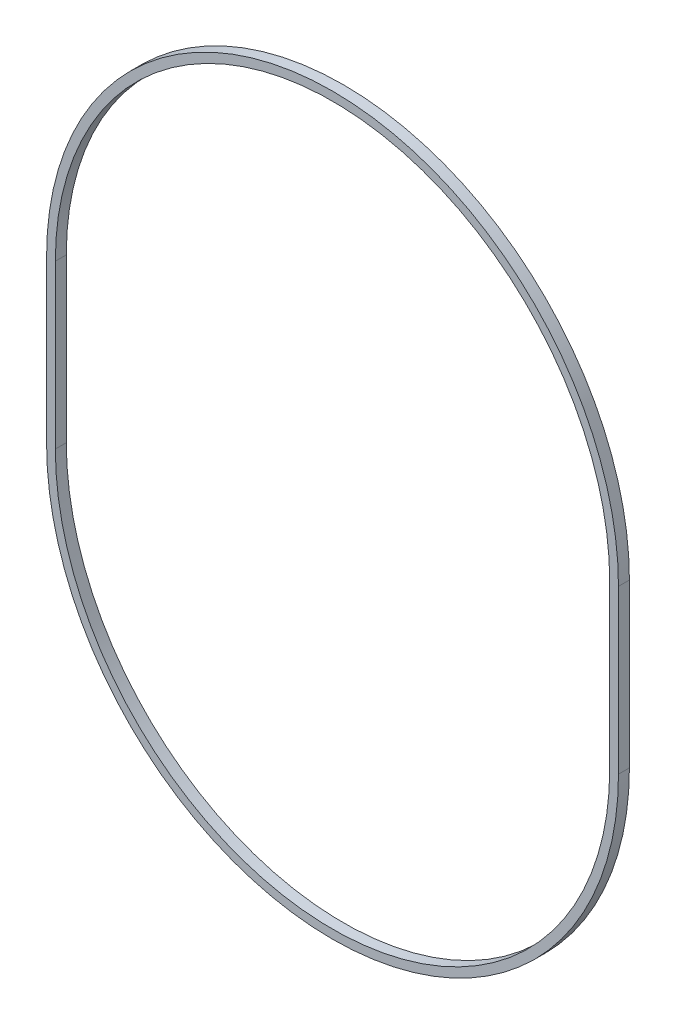
ISO-10303-21;
HEADER;
FILE_DESCRIPTION(('STEP AP214'),'2;1');
FILE_NAME('part.step','',(''),(''),'','','');
FILE_SCHEMA(('AUTOMOTIVE_DESIGN { 1 0 10303 214 1 1 1 1 }'));
ENDSEC;
DATA;
#1=APPLICATION_CONTEXT('core data for automotive mechanical design processes');
#2=APPLICATION_PROTOCOL_DEFINITION('international standard','automotive_design',2000,#1);
#3=PRODUCT_CONTEXT('',#1,'mechanical');
#4=PRODUCT('Part','Part','',(#3));
#5=PRODUCT_RELATED_PRODUCT_CATEGORY('part','',(#4));
#6=PRODUCT_DEFINITION_FORMATION('','',#4);
#7=PRODUCT_DEFINITION_CONTEXT('part definition',#1,'design');
#8=PRODUCT_DEFINITION('design','',#6,#7);
#9=PRODUCT_DEFINITION_SHAPE('','',#8);
#10=(LENGTH_UNIT() NAMED_UNIT(*) SI_UNIT(.MILLI.,.METRE.));
#11=(NAMED_UNIT(*) PLANE_ANGLE_UNIT() SI_UNIT($,.RADIAN.));
#12=(NAMED_UNIT(*) SI_UNIT($,.STERADIAN.) SOLID_ANGLE_UNIT());
#13=UNCERTAINTY_MEASURE_WITH_UNIT(LENGTH_MEASURE(1.E-05),#10,'distance_accuracy_value','');
#14=(GEOMETRIC_REPRESENTATION_CONTEXT(3) GLOBAL_UNCERTAINTY_ASSIGNED_CONTEXT((#13)) GLOBAL_UNIT_ASSIGNED_CONTEXT((#10,
#11,#12)) REPRESENTATION_CONTEXT('',''));
#15=CARTESIAN_POINT('',(0.,0.,0.));
#16=DIRECTION('',(0.,0.,1.));
#17=DIRECTION('',(1.,0.,0.));
#18=AXIS2_PLACEMENT_3D('',#15,#16,#17);
#19=CARTESIAN_POINT('',(98.,0.,1.875));
#20=DIRECTION('',(-1.,0.,0.));
#21=DIRECTION('',(0.,0.,1.));
#22=AXIS2_PLACEMENT_3D('',#19,#20,#21);
#23=PLANE('',#22);
#24=DIRECTION('',(0.,1.,0.));
#25=VECTOR('',#24,1.);
#26=CARTESIAN_POINT('',(98.,0.,-1.875));
#27=LINE('',#26,#25);
#28=CARTESIAN_POINT('',(98.,-27.875,-1.875));
#29=VERTEX_POINT('',#28);
#30=CARTESIAN_POINT('',(98.,27.875,-1.875));
#31=VERTEX_POINT('',#30);
#32=EDGE_CURVE('E141',#29,#31,#27,.T.);
#33=ORIENTED_EDGE('',*,*,#32,.T.);
#34=DIRECTION('',(0.,0.,-1.));
#35=VECTOR('',#34,1.);
#36=CARTESIAN_POINT('',(98.,27.875,1.875));
#37=LINE('',#36,#35);
#38=CARTESIAN_POINT('',(98.,27.875,1.875));
#39=VERTEX_POINT('',#38);
#40=EDGE_CURVE('E11',#39,#31,#37,.T.);
#41=ORIENTED_EDGE('',*,*,#40,.F.);
#42=DIRECTION('',(0.,1.,0.));
#43=VECTOR('',#42,1.);
#44=CARTESIAN_POINT('',(98.,0.,1.875));
#45=LINE('',#44,#43);
#46=CARTESIAN_POINT('',(98.,-27.875,1.875));
#47=VERTEX_POINT('',#46);
#48=EDGE_CURVE('E115',#47,#39,#45,.T.);
#49=ORIENTED_EDGE('',*,*,#48,.F.);
#50=DIRECTION('',(0.,0.,-1.));
#51=VECTOR('',#50,1.);
#52=CARTESIAN_POINT('',(98.,-27.875,1.875));
#53=LINE('',#52,#51);
#54=EDGE_CURVE('E148',#47,#29,#53,.T.);
#55=ORIENTED_EDGE('',*,*,#54,.T.);
#56=EDGE_LOOP('',(#33,#41,#49,#55));
#57=FACE_BOUND('',#56,.T.);
#58=ADVANCED_FACE('F34',(#57),#23,.F.);
#59=CARTESIAN_POINT('',(0.,27.875,1.875));
#60=DIRECTION('',(0.,0.,-1.));
#61=DIRECTION('',(-1.,0.,0.));
#62=AXIS2_PLACEMENT_3D('',#59,#60,#61);
#63=CYLINDRICAL_SURFACE('',#62,98.);
#64=CARTESIAN_POINT('',(0.,27.875,-1.875));
#65=DIRECTION('',(0.,0.,1.));
#66=DIRECTION('',(1.,0.,0.));
#67=AXIS2_PLACEMENT_3D('',#64,#65,#66);
#68=CIRCLE('',#67,98.);
#69=CARTESIAN_POINT('',(-98.,27.875,-1.875));
#70=VERTEX_POINT('',#69);
#71=EDGE_CURVE('E120',#31,#70,#68,.T.);
#72=ORIENTED_EDGE('',*,*,#71,.T.);
#73=DIRECTION('',(0.,0.,-1.));
#74=VECTOR('',#73,1.);
#75=CARTESIAN_POINT('',(-98.,27.875,1.875));
#76=LINE('',#75,#74);
#77=CARTESIAN_POINT('',(-98.,27.875,1.875));
#78=VERTEX_POINT('',#77);
#79=EDGE_CURVE('E44',#78,#70,#76,.T.);
#80=ORIENTED_EDGE('',*,*,#79,.F.);
#81=CARTESIAN_POINT('',(0.,27.875,1.875));
#82=DIRECTION('',(0.,0.,1.));
#83=DIRECTION('',(1.,0.,0.));
#84=AXIS2_PLACEMENT_3D('',#81,#82,#83);
#85=CIRCLE('',#84,98.);
#86=EDGE_CURVE('E109',#39,#78,#85,.T.);
#87=ORIENTED_EDGE('',*,*,#86,.F.);
#88=ORIENTED_EDGE('',*,*,#40,.T.);
#89=EDGE_LOOP('',(#72,#80,#87,#88));
#90=FACE_BOUND('',#89,.T.);
#91=ADVANCED_FACE('F119',(#90),#63,.T.);
#92=CARTESIAN_POINT('',(-98.,0.,1.875));
#93=DIRECTION('',(1.,0.,0.));
#94=DIRECTION('',(0.,1.,0.));
#95=AXIS2_PLACEMENT_3D('',#92,#93,#94);
#96=PLANE('',#95);
#97=DIRECTION('',(0.,-1.,0.));
#98=VECTOR('',#97,1.);
#99=CARTESIAN_POINT('',(-98.,0.,-1.875));
#100=LINE('',#99,#98);
#101=CARTESIAN_POINT('',(-98.,-27.875,-1.875));
#102=VERTEX_POINT('',#101);
#103=EDGE_CURVE('E82',#70,#102,#100,.T.);
#104=ORIENTED_EDGE('',*,*,#103,.T.);
#105=DIRECTION('',(0.,0.,-1.));
#106=VECTOR('',#105,1.);
#107=CARTESIAN_POINT('',(-98.,-27.875,1.875));
#108=LINE('',#107,#106);
#109=CARTESIAN_POINT('',(-98.,-27.875,1.875));
#110=VERTEX_POINT('',#109);
#111=EDGE_CURVE('E121',#110,#102,#108,.T.);
#112=ORIENTED_EDGE('',*,*,#111,.F.);
#113=DIRECTION('',(0.,-1.,0.));
#114=VECTOR('',#113,1.);
#115=CARTESIAN_POINT('',(-98.,0.,1.875));
#116=LINE('',#115,#114);
#117=EDGE_CURVE('E113',#78,#110,#116,.T.);
#118=ORIENTED_EDGE('',*,*,#117,.F.);
#119=ORIENTED_EDGE('',*,*,#79,.T.);
#120=EDGE_LOOP('',(#104,#112,#118,#119));
#121=FACE_BOUND('',#120,.T.);
#122=ADVANCED_FACE('F123',(#121),#96,.F.);
#123=CARTESIAN_POINT('',(0.,-27.875,1.875));
#124=DIRECTION('',(0.,0.,-1.));
#125=DIRECTION('',(-1.,0.,0.));
#126=AXIS2_PLACEMENT_3D('',#123,#124,#125);
#127=CYLINDRICAL_SURFACE('',#126,95.);
#128=CARTESIAN_POINT('',(0.,-27.875,-1.875));
#129=DIRECTION('',(0.,0.,1.));
#130=DIRECTION('',(1.,0.,0.));
#131=AXIS2_PLACEMENT_3D('',#128,#129,#130);
#132=CIRCLE('',#131,95.);
#133=CARTESIAN_POINT('',(-95.,-27.875,-1.875));
#134=VERTEX_POINT('',#133);
#135=CARTESIAN_POINT('',(95.,-27.875,-1.875));
#136=VERTEX_POINT('',#135);
#137=EDGE_CURVE('E129',#134,#136,#132,.T.);
#138=ORIENTED_EDGE('',*,*,#137,.F.);
#139=DIRECTION('',(0.,0.,-1.));
#140=VECTOR('',#139,1.);
#141=CARTESIAN_POINT('',(-95.,-27.875,1.875));
#142=LINE('',#141,#140);
#143=CARTESIAN_POINT('',(-95.,-27.875,1.875));
#144=VERTEX_POINT('',#143);
#145=EDGE_CURVE('E38',#144,#134,#142,.T.);
#146=ORIENTED_EDGE('',*,*,#145,.F.);
#147=CARTESIAN_POINT('',(0.,-27.875,1.875));
#148=DIRECTION('',(0.,0.,1.));
#149=DIRECTION('',(1.,0.,0.));
#150=AXIS2_PLACEMENT_3D('',#147,#148,#149);
#151=CIRCLE('',#150,95.);
#152=CARTESIAN_POINT('',(95.,-27.875,1.875));
#153=VERTEX_POINT('',#152);
#154=EDGE_CURVE('E147',#144,#153,#151,.T.);
#155=ORIENTED_EDGE('',*,*,#154,.T.);
#156=DIRECTION('',(0.,0.,-1.));
#157=VECTOR('',#156,1.);
#158=CARTESIAN_POINT('',(95.,-27.875,1.875));
#159=LINE('',#158,#157);
#160=EDGE_CURVE('E125',#153,#136,#159,.T.);
#161=ORIENTED_EDGE('',*,*,#160,.T.);
#162=EDGE_LOOP('',(#138,#146,#155,#161));
#163=FACE_BOUND('',#162,.T.);
#164=ADVANCED_FACE('F36',(#163),#127,.F.);
#165=CARTESIAN_POINT('',(-95.,0.,1.875));
#166=DIRECTION('',(1.,0.,0.));
#167=DIRECTION('',(0.,1.,0.));
#168=AXIS2_PLACEMENT_3D('',#165,#166,#167);
#169=PLANE('',#168);
#170=DIRECTION('',(0.,-1.,0.));
#171=VECTOR('',#170,1.);
#172=CARTESIAN_POINT('',(-95.,0.,-1.875));
#173=LINE('',#172,#171);
#174=CARTESIAN_POINT('',(-95.,27.875,-1.875));
#175=VERTEX_POINT('',#174);
#176=EDGE_CURVE('E132',#175,#134,#173,.T.);
#177=ORIENTED_EDGE('',*,*,#176,.F.);
#178=DIRECTION('',(0.,0.,-1.));
#179=VECTOR('',#178,1.);
#180=CARTESIAN_POINT('',(-95.,27.875,1.875));
#181=LINE('',#180,#179);
#182=CARTESIAN_POINT('',(-95.,27.875,1.875));
#183=VERTEX_POINT('',#182);
#184=EDGE_CURVE('E153',#183,#175,#181,.T.);
#185=ORIENTED_EDGE('',*,*,#184,.F.);
#186=DIRECTION('',(0.,-1.,0.));
#187=VECTOR('',#186,1.);
#188=CARTESIAN_POINT('',(-95.,0.,1.875));
#189=LINE('',#188,#187);
#190=EDGE_CURVE('E162',#183,#144,#189,.T.);
#191=ORIENTED_EDGE('',*,*,#190,.T.);
#192=ORIENTED_EDGE('',*,*,#145,.T.);
#193=EDGE_LOOP('',(#177,#185,#191,#192));
#194=FACE_BOUND('',#193,.T.);
#195=ADVANCED_FACE('F160',(#194),#169,.T.);
#196=CARTESIAN_POINT('',(0.,27.875,1.875));
#197=DIRECTION('',(0.,0.,-1.));
#198=DIRECTION('',(-1.,0.,0.));
#199=AXIS2_PLACEMENT_3D('',#196,#197,#198);
#200=CYLINDRICAL_SURFACE('',#199,95.);
#201=CARTESIAN_POINT('',(0.,27.875,-1.875));
#202=DIRECTION('',(0.,0.,1.));
#203=DIRECTION('',(1.,0.,0.));
#204=AXIS2_PLACEMENT_3D('',#201,#202,#203);
#205=CIRCLE('',#204,95.);
#206=CARTESIAN_POINT('',(95.,27.875,-1.875));
#207=VERTEX_POINT('',#206);
#208=EDGE_CURVE('E135',#207,#175,#205,.T.);
#209=ORIENTED_EDGE('',*,*,#208,.F.);
#210=DIRECTION('',(0.,0.,-1.));
#211=VECTOR('',#210,1.);
#212=CARTESIAN_POINT('',(95.,27.875,1.875));
#213=LINE('',#212,#211);
#214=CARTESIAN_POINT('',(95.,27.875,1.875));
#215=VERTEX_POINT('',#214);
#216=EDGE_CURVE('E152',#215,#207,#213,.T.);
#217=ORIENTED_EDGE('',*,*,#216,.F.);
#218=CARTESIAN_POINT('',(0.,27.875,1.875));
#219=DIRECTION('',(0.,0.,1.));
#220=DIRECTION('',(1.,0.,0.));
#221=AXIS2_PLACEMENT_3D('',#218,#219,#220);
#222=CIRCLE('',#221,95.);
#223=EDGE_CURVE('E169',#215,#183,#222,.T.);
#224=ORIENTED_EDGE('',*,*,#223,.T.);
#225=ORIENTED_EDGE('',*,*,#184,.T.);
#226=EDGE_LOOP('',(#209,#217,#224,#225));
#227=FACE_BOUND('',#226,.T.);
#228=ADVANCED_FACE('F167',(#227),#200,.F.);
#229=CARTESIAN_POINT('',(95.,0.,1.875));
#230=DIRECTION('',(-1.,0.,0.));
#231=DIRECTION('',(0.,0.,1.));
#232=AXIS2_PLACEMENT_3D('',#229,#230,#231);
#233=PLANE('',#232);
#234=DIRECTION('',(0.,1.,0.));
#235=VECTOR('',#234,1.);
#236=CARTESIAN_POINT('',(95.,0.,-1.875));
#237=LINE('',#236,#235);
#238=EDGE_CURVE('E138',#136,#207,#237,.T.);
#239=ORIENTED_EDGE('',*,*,#238,.F.);
#240=ORIENTED_EDGE('',*,*,#160,.F.);
#241=DIRECTION('',(0.,1.,0.));
#242=VECTOR('',#241,1.);
#243=CARTESIAN_POINT('',(95.,0.,1.875));
#244=LINE('',#243,#242);
#245=EDGE_CURVE('E174',#153,#215,#244,.T.);
#246=ORIENTED_EDGE('',*,*,#245,.T.);
#247=ORIENTED_EDGE('',*,*,#216,.T.);
#248=EDGE_LOOP('',(#239,#240,#246,#247));
#249=FACE_BOUND('',#248,.T.);
#250=ADVANCED_FACE('F176',(#249),#233,.T.);
#251=CARTESIAN_POINT('',(0.,-27.875,1.875));
#252=DIRECTION('',(0.,0.,-1.));
#253=DIRECTION('',(-1.,0.,0.));
#254=AXIS2_PLACEMENT_3D('',#251,#252,#253);
#255=CYLINDRICAL_SURFACE('',#254,98.);
#256=CARTESIAN_POINT('',(0.,-27.875,-1.875));
#257=DIRECTION('',(0.,0.,1.));
#258=DIRECTION('',(1.,0.,0.));
#259=AXIS2_PLACEMENT_3D('',#256,#257,#258);
#260=CIRCLE('',#259,98.);
#261=EDGE_CURVE('E88',#102,#29,#260,.T.);
#262=ORIENTED_EDGE('',*,*,#261,.T.);
#263=ORIENTED_EDGE('',*,*,#54,.F.);
#264=CARTESIAN_POINT('',(0.,-27.875,1.875));
#265=DIRECTION('',(0.,0.,1.));
#266=DIRECTION('',(1.,0.,0.));
#267=AXIS2_PLACEMENT_3D('',#264,#265,#266);
#268=CIRCLE('',#267,98.);
#269=EDGE_CURVE('E53',#110,#47,#268,.T.);
#270=ORIENTED_EDGE('',*,*,#269,.F.);
#271=ORIENTED_EDGE('',*,*,#111,.T.);
#272=EDGE_LOOP('',(#262,#263,#270,#271));
#273=FACE_BOUND('',#272,.T.);
#274=ADVANCED_FACE('F181',(#273),#255,.T.);
#275=CARTESIAN_POINT('',(0.,0.,1.875));
#276=DIRECTION('',(0.,0.,1.));
#277=DIRECTION('',(1.,0.,0.));
#278=AXIS2_PLACEMENT_3D('',#275,#276,#277);
#279=PLANE('',#278);
#280=ORIENTED_EDGE('',*,*,#154,.F.);
#281=ORIENTED_EDGE('',*,*,#190,.F.);
#282=ORIENTED_EDGE('',*,*,#223,.F.);
#283=ORIENTED_EDGE('',*,*,#245,.F.);
#284=EDGE_LOOP('',(#280,#281,#282,#283));
#285=FACE_BOUND('',#284,.T.);
#286=ORIENTED_EDGE('',*,*,#48,.T.);
#287=ORIENTED_EDGE('',*,*,#86,.T.);
#288=ORIENTED_EDGE('',*,*,#117,.T.);
#289=ORIENTED_EDGE('',*,*,#269,.T.);
#290=EDGE_LOOP('',(#286,#287,#288,#289));
#291=FACE_BOUND('',#290,.T.);
#292=ADVANCED_FACE('F111',(#285,#291),#279,.T.);
#293=CARTESIAN_POINT('',(0.,0.,-1.875));
#294=DIRECTION('',(0.,0.,1.));
#295=DIRECTION('',(1.,0.,0.));
#296=AXIS2_PLACEMENT_3D('',#293,#294,#295);
#297=PLANE('',#296);
#298=ORIENTED_EDGE('',*,*,#137,.T.);
#299=ORIENTED_EDGE('',*,*,#238,.T.);
#300=ORIENTED_EDGE('',*,*,#208,.T.);
#301=ORIENTED_EDGE('',*,*,#176,.T.);
#302=EDGE_LOOP('',(#298,#299,#300,#301));
#303=FACE_BOUND('',#302,.T.);
#304=ORIENTED_EDGE('',*,*,#32,.F.);
#305=ORIENTED_EDGE('',*,*,#261,.F.);
#306=ORIENTED_EDGE('',*,*,#103,.F.);
#307=ORIENTED_EDGE('',*,*,#71,.F.);
#308=EDGE_LOOP('',(#304,#305,#306,#307));
#309=FACE_BOUND('',#308,.T.);
#310=ADVANCED_FACE('F165',(#303,#309),#297,.F.);
#311=CLOSED_SHELL('',(#58,#91,#122,#164,#195,#228,#250,#274,#292,#310));
#312=MANIFOLD_SOLID_BREP('B2',#311);
#313=ADVANCED_BREP_SHAPE_REPRESENTATION('',(#18,#312),#14);
#314=SHAPE_DEFINITION_REPRESENTATION(#9,#313);
ENDSEC;
END-ISO-10303-21;
